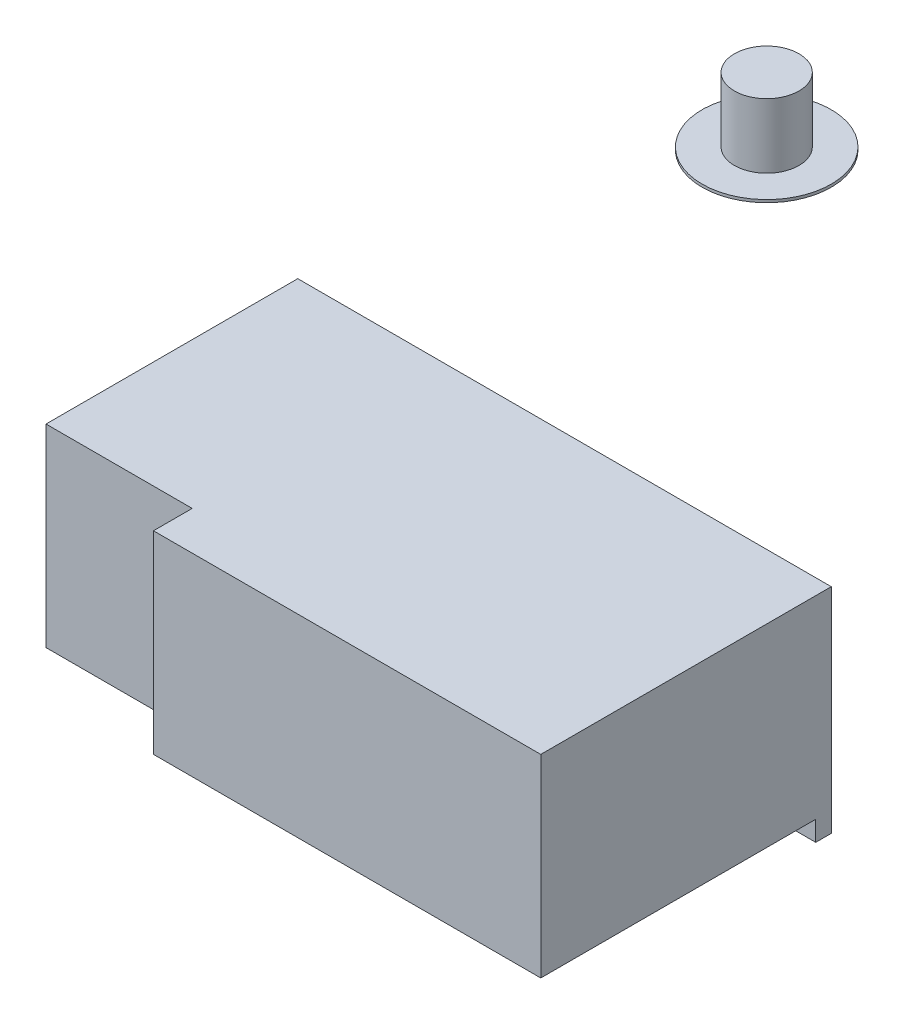
ISO-10303-21;
HEADER;
FILE_DESCRIPTION(('STEP AP214'),'2;1');
FILE_NAME('part.step','',(''),(''),'','','');
FILE_SCHEMA(('AUTOMOTIVE_DESIGN { 1 0 10303 214 1 1 1 1 }'));
ENDSEC;
DATA;
#1=APPLICATION_CONTEXT('core data for automotive mechanical design processes');
#2=APPLICATION_PROTOCOL_DEFINITION('international standard','automotive_design',2000,#1);
#3=PRODUCT_CONTEXT('',#1,'mechanical');
#4=PRODUCT('Part','Part','',(#3));
#5=PRODUCT_RELATED_PRODUCT_CATEGORY('part','',(#4));
#6=PRODUCT_DEFINITION_FORMATION('','',#4);
#7=PRODUCT_DEFINITION_CONTEXT('part definition',#1,'design');
#8=PRODUCT_DEFINITION('design','',#6,#7);
#9=PRODUCT_DEFINITION_SHAPE('','',#8);
#10=(LENGTH_UNIT() NAMED_UNIT(*) SI_UNIT(.MILLI.,.METRE.));
#11=(NAMED_UNIT(*) PLANE_ANGLE_UNIT() SI_UNIT($,.RADIAN.));
#12=(NAMED_UNIT(*) SI_UNIT($,.STERADIAN.) SOLID_ANGLE_UNIT());
#13=UNCERTAINTY_MEASURE_WITH_UNIT(LENGTH_MEASURE(1.E-05),#10,'distance_accuracy_value','');
#14=(GEOMETRIC_REPRESENTATION_CONTEXT(3) GLOBAL_UNCERTAINTY_ASSIGNED_CONTEXT((#13)) GLOBAL_UNIT_ASSIGNED_CONTEXT((#10,
#11,#12)) REPRESENTATION_CONTEXT('',''));
#15=CARTESIAN_POINT('',(0.,0.,0.));
#16=DIRECTION('',(0.,0.,1.));
#17=DIRECTION('',(1.,0.,0.));
#18=AXIS2_PLACEMENT_3D('',#15,#16,#17);
#19=CARTESIAN_POINT('',(0.,24.5,-10.));
#20=DIRECTION('',(0.,-1.,0.));
#21=DIRECTION('',(0.,0.,-1.));
#22=AXIS2_PLACEMENT_3D('',#19,#20,#21);
#23=CYLINDRICAL_SURFACE('',#22,5.);
#24=CARTESIAN_POINT('',(0.,24.2878637800781,-10.));
#25=DIRECTION('',(0.,1.,0.));
#26=DIRECTION('',(0.,0.,1.));
#27=AXIS2_PLACEMENT_3D('',#24,#25,#26);
#28=CIRCLE('',#27,5.);
#29=CARTESIAN_POINT('',(0.,24.2878637800781,-5.));
#30=VERTEX_POINT('',#29);
#31=EDGE_CURVE('E62',#30,#30,#28,.T.);
#32=ORIENTED_EDGE('',*,*,#31,.T.);
#33=EDGE_LOOP('',(#32));
#34=FACE_BOUND('',#33,.T.);
#35=CARTESIAN_POINT('',(0.,24.5,-10.));
#36=DIRECTION('',(0.,1.,0.));
#37=DIRECTION('',(0.,0.,1.));
#38=AXIS2_PLACEMENT_3D('',#35,#36,#37);
#39=CIRCLE('',#38,5.);
#40=CARTESIAN_POINT('',(0.,24.5,-5.));
#41=VERTEX_POINT('',#40);
#42=EDGE_CURVE('E58',#41,#41,#39,.T.);
#43=ORIENTED_EDGE('',*,*,#42,.F.);
#44=EDGE_LOOP('',(#43));
#45=FACE_BOUND('',#44,.T.);
#46=ADVANCED_FACE('F47',(#34,#45),#23,.T.);
#47=CARTESIAN_POINT('',(0.,24.5,-10.));
#48=DIRECTION('',(0.,1.,0.));
#49=DIRECTION('',(0.,0.,1.));
#50=AXIS2_PLACEMENT_3D('',#47,#48,#49);
#51=PLANE('',#50);
#52=CARTESIAN_POINT('',(0.,24.5,-10.));
#53=DIRECTION('',(0.,1.,0.));
#54=DIRECTION('',(0.,0.,1.));
#55=AXIS2_PLACEMENT_3D('',#52,#53,#54);
#56=CIRCLE('',#55,2.5);
#57=CARTESIAN_POINT('',(0.,24.5,-7.5));
#58=VERTEX_POINT('',#57);
#59=EDGE_CURVE('E54',#58,#58,#56,.T.);
#60=ORIENTED_EDGE('',*,*,#59,.F.);
#61=EDGE_LOOP('',(#60));
#62=FACE_BOUND('',#61,.T.);
#63=ORIENTED_EDGE('',*,*,#42,.T.);
#64=EDGE_LOOP('',(#63));
#65=FACE_BOUND('',#64,.T.);
#66=ADVANCED_FACE('F77',(#62,#65),#51,.T.);
#67=CARTESIAN_POINT('',(0.,29.5,-10.));
#68=DIRECTION('',(0.,-1.,0.));
#69=DIRECTION('',(0.,0.,-1.));
#70=AXIS2_PLACEMENT_3D('',#67,#68,#69);
#71=CYLINDRICAL_SURFACE('',#70,2.5);
#72=CARTESIAN_POINT('',(0.,29.5,-10.));
#73=DIRECTION('',(0.,1.,0.));
#74=DIRECTION('',(0.,0.,1.));
#75=AXIS2_PLACEMENT_3D('',#72,#73,#74);
#76=CIRCLE('',#75,2.5);
#77=CARTESIAN_POINT('',(0.,29.5,-7.5));
#78=VERTEX_POINT('',#77);
#79=EDGE_CURVE('E12',#78,#78,#76,.T.);
#80=ORIENTED_EDGE('',*,*,#79,.F.);
#81=EDGE_LOOP('',(#80));
#82=FACE_BOUND('',#81,.T.);
#83=ORIENTED_EDGE('',*,*,#59,.T.);
#84=EDGE_LOOP('',(#83));
#85=FACE_BOUND('',#84,.T.);
#86=ADVANCED_FACE('F75',(#82,#85),#71,.T.);
#87=CARTESIAN_POINT('',(0.,29.5,-10.));
#88=DIRECTION('',(0.,1.,0.));
#89=DIRECTION('',(0.,0.,1.));
#90=AXIS2_PLACEMENT_3D('',#87,#88,#89);
#91=PLANE('',#90);
#92=ORIENTED_EDGE('',*,*,#79,.T.);
#93=EDGE_LOOP('',(#92));
#94=FACE_BOUND('',#93,.T.);
#95=ADVANCED_FACE('F71',(#94),#91,.T.);
#96=CARTESIAN_POINT('',(26.55,24.2878637800781,0.));
#97=DIRECTION('',(0.,1.,0.));
#98=DIRECTION('',(0.,0.,1.));
#99=AXIS2_PLACEMENT_3D('',#96,#97,#98);
#100=PLANE('',#99);
#101=ORIENTED_EDGE('',*,*,#31,.F.);
#102=EDGE_LOOP('',(#101));
#103=FACE_BOUND('',#102,.T.);
#104=ADVANCED_FACE('F49',(#103),#100,.F.);
#105=CLOSED_SHELL('',(#46,#66,#86,#95,#104));
#106=MANIFOLD_SOLID_BREP('B2',#105);
#107=CARTESIAN_POINT('',(-15.,7.5,-22.5));
#108=DIRECTION('',(1.,0.,0.));
#109=DIRECTION('',(0.,0.,-1.));
#110=AXIS2_PLACEMENT_3D('',#107,#108,#109);
#111=PLANE('',#110);
#112=DIRECTION('',(0.,1.,0.));
#113=VECTOR('',#112,1.);
#114=CARTESIAN_POINT('',(-15.,7.5,19.5));
#115=LINE('',#114,#113);
#116=CARTESIAN_POINT('',(-15.,-7.5,19.5));
#117=VERTEX_POINT('',#116);
#118=CARTESIAN_POINT('',(-15.,7.5,19.5));
#119=VERTEX_POINT('',#118);
#120=EDGE_CURVE('E197',#117,#119,#115,.T.);
#121=ORIENTED_EDGE('',*,*,#120,.F.);
#122=DIRECTION('',(0.,0.,1.));
#123=VECTOR('',#122,1.);
#124=CARTESIAN_POINT('',(-15.,-7.5,-22.5));
#125=LINE('',#124,#123);
#126=CARTESIAN_POINT('',(-15.,-7.5,22.5));
#127=VERTEX_POINT('',#126);
#128=EDGE_CURVE('E214',#117,#127,#125,.T.);
#129=ORIENTED_EDGE('',*,*,#128,.T.);
#130=DIRECTION('',(0.,-1.,0.));
#131=VECTOR('',#130,1.);
#132=CARTESIAN_POINT('',(-15.,7.5,22.5));
#133=LINE('',#132,#131);
#134=CARTESIAN_POINT('',(-15.,7.5,22.5));
#135=VERTEX_POINT('',#134);
#136=EDGE_CURVE('E126',#135,#127,#133,.T.);
#137=ORIENTED_EDGE('',*,*,#136,.F.);
#138=DIRECTION('',(0.,0.,1.));
#139=VECTOR('',#138,1.);
#140=CARTESIAN_POINT('',(-15.,7.5,-22.5));
#141=LINE('',#140,#139);
#142=EDGE_CURVE('E206',#119,#135,#141,.T.);
#143=ORIENTED_EDGE('',*,*,#142,.F.);
#144=EDGE_LOOP('',(#121,#129,#137,#143));
#145=FACE_BOUND('',#144,.T.);
#146=ADVANCED_FACE('F118',(#145),#111,.F.);
#147=CARTESIAN_POINT('',(-31.,7.5,19.5));
#148=DIRECTION('',(0.,0.,-1.));
#149=DIRECTION('',(0.,1.,0.));
#150=AXIS2_PLACEMENT_3D('',#147,#148,#149);
#151=PLANE('',#150);
#152=DIRECTION('',(1.,0.,0.));
#153=VECTOR('',#152,1.);
#154=CARTESIAN_POINT('',(-31.,7.5,19.5));
#155=LINE('',#154,#153);
#156=CARTESIAN_POINT('',(-26.3220500008362,7.5,19.5));
#157=VERTEX_POINT('',#156);
#158=EDGE_CURVE('E191',#157,#119,#155,.T.);
#159=ORIENTED_EDGE('',*,*,#158,.F.);
#160=DIRECTION('',(0.,1.,0.));
#161=VECTOR('',#160,1.);
#162=CARTESIAN_POINT('',(-26.3220500008362,-12.5,19.5));
#163=LINE('',#162,#161);
#164=CARTESIAN_POINT('',(-26.3220500008362,-7.5,19.5));
#165=VERTEX_POINT('',#164);
#166=EDGE_CURVE('E181',#165,#157,#163,.T.);
#167=ORIENTED_EDGE('',*,*,#166,.F.);
#168=DIRECTION('',(1.,0.,0.));
#169=VECTOR('',#168,1.);
#170=CARTESIAN_POINT('',(-31.,-7.5,19.5));
#171=LINE('',#170,#169);
#172=EDGE_CURVE('E140',#165,#117,#171,.T.);
#173=ORIENTED_EDGE('',*,*,#172,.T.);
#174=ORIENTED_EDGE('',*,*,#120,.T.);
#175=EDGE_LOOP('',(#159,#167,#173,#174));
#176=FACE_BOUND('',#175,.T.);
#177=ADVANCED_FACE('F196',(#176),#151,.F.);
#178=CARTESIAN_POINT('',(-31.,-9.05,1.20322249247065));
#179=DIRECTION('',(0.,0.,-1.));
#180=DIRECTION('',(-1.,0.,0.));
#181=AXIS2_PLACEMENT_3D('',#178,#179,#180);
#182=PLANE('',#181);
#183=DIRECTION('',(-1.,0.,0.));
#184=VECTOR('',#183,1.);
#185=CARTESIAN_POINT('',(-31.,-7.5,1.20322249247065));
#186=LINE('',#185,#184);
#187=CARTESIAN_POINT('',(15.,-7.5,1.20322249247065));
#188=VERTEX_POINT('',#187);
#189=CARTESIAN_POINT('',(-26.3220500008362,-7.5,1.20322249247065));
#190=VERTEX_POINT('',#189);
#191=EDGE_CURVE('E232',#188,#190,#186,.T.);
#192=ORIENTED_EDGE('',*,*,#191,.T.);
#193=DIRECTION('',(0.,-1.,0.));
#194=VECTOR('',#193,1.);
#195=CARTESIAN_POINT('',(-26.3220500008362,-9.05,1.20322249247065));
#196=LINE('',#195,#194);
#197=CARTESIAN_POINT('',(-26.3220500008362,-9.05,1.20322249247065));
#198=VERTEX_POINT('',#197);
#199=EDGE_CURVE('E254',#190,#198,#196,.T.);
#200=ORIENTED_EDGE('',*,*,#199,.T.);
#201=DIRECTION('',(-1.,0.,0.));
#202=VECTOR('',#201,1.);
#203=CARTESIAN_POINT('',(-31.,-9.05,1.20322249247065));
#204=LINE('',#203,#202);
#205=CARTESIAN_POINT('',(15.,-9.05,1.20322249247065));
#206=VERTEX_POINT('',#205);
#207=EDGE_CURVE('E245',#206,#198,#204,.T.);
#208=ORIENTED_EDGE('',*,*,#207,.F.);
#209=DIRECTION('',(0.,1.,0.));
#210=VECTOR('',#209,1.);
#211=CARTESIAN_POINT('',(15.,-9.05,1.20322249247065));
#212=LINE('',#211,#210);
#213=EDGE_CURVE('E237',#206,#188,#212,.T.);
#214=ORIENTED_EDGE('',*,*,#213,.T.);
#215=EDGE_LOOP('',(#192,#200,#208,#214));
#216=FACE_BOUND('',#215,.T.);
#217=ADVANCED_FACE('F278',(#216),#182,.F.);
#218=CARTESIAN_POINT('',(0.,-7.5,0.));
#219=DIRECTION('',(0.,1.,0.));
#220=DIRECTION('',(0.,0.,1.));
#221=AXIS2_PLACEMENT_3D('',#218,#219,#220);
#222=PLANE('',#221);
#223=ORIENTED_EDGE('',*,*,#172,.F.);
#224=DIRECTION('',(0.,0.,-1.));
#225=VECTOR('',#224,1.);
#226=CARTESIAN_POINT('',(-26.3220500008362,-7.5,0.));
#227=LINE('',#226,#225);
#228=EDGE_CURVE('E184',#165,#190,#227,.T.);
#229=ORIENTED_EDGE('',*,*,#228,.T.);
#230=ORIENTED_EDGE('',*,*,#191,.F.);
#231=DIRECTION('',(0.,0.,-1.));
#232=VECTOR('',#231,1.);
#233=CARTESIAN_POINT('',(15.,-7.5,-22.5));
#234=LINE('',#233,#232);
#235=CARTESIAN_POINT('',(15.,-7.5,22.5));
#236=VERTEX_POINT('',#235);
#237=EDGE_CURVE('E199',#236,#188,#234,.T.);
#238=ORIENTED_EDGE('',*,*,#237,.F.);
#239=DIRECTION('',(1.,0.,0.));
#240=VECTOR('',#239,1.);
#241=CARTESIAN_POINT('',(-15.,-7.5,22.5));
#242=LINE('',#241,#240);
#243=EDGE_CURVE('E207',#127,#236,#242,.T.);
#244=ORIENTED_EDGE('',*,*,#243,.F.);
#245=ORIENTED_EDGE('',*,*,#128,.F.);
#246=EDGE_LOOP('',(#223,#229,#230,#238,#244,#245));
#247=FACE_BOUND('',#246,.T.);
#248=ADVANCED_FACE('F229',(#247),#222,.F.);
#249=CARTESIAN_POINT('',(-15.,7.5,22.5));
#250=DIRECTION('',(0.,0.,-1.));
#251=DIRECTION('',(-1.,0.,0.));
#252=AXIS2_PLACEMENT_3D('',#249,#250,#251);
#253=PLANE('',#252);
#254=ORIENTED_EDGE('',*,*,#243,.T.);
#255=DIRECTION('',(0.,-1.,0.));
#256=VECTOR('',#255,1.);
#257=CARTESIAN_POINT('',(15.,7.5,22.5));
#258=LINE('',#257,#256);
#259=CARTESIAN_POINT('',(15.,7.5,22.5));
#260=VERTEX_POINT('',#259);
#261=EDGE_CURVE('E211',#260,#236,#258,.T.);
#262=ORIENTED_EDGE('',*,*,#261,.F.);
#263=DIRECTION('',(1.,0.,0.));
#264=VECTOR('',#263,1.);
#265=CARTESIAN_POINT('',(-15.,7.5,22.5));
#266=LINE('',#265,#264);
#267=EDGE_CURVE('E209',#135,#260,#266,.T.);
#268=ORIENTED_EDGE('',*,*,#267,.F.);
#269=ORIENTED_EDGE('',*,*,#136,.T.);
#270=EDGE_LOOP('',(#254,#262,#268,#269));
#271=FACE_BOUND('',#270,.T.);
#272=ADVANCED_FACE('F223',(#271),#253,.F.);
#273=CARTESIAN_POINT('',(0.,-9.05,0.));
#274=DIRECTION('',(0.,1.,0.));
#275=DIRECTION('',(0.,0.,1.));
#276=AXIS2_PLACEMENT_3D('',#273,#274,#275);
#277=PLANE('',#276);
#278=ORIENTED_EDGE('',*,*,#207,.T.);
#279=DIRECTION('',(0.,0.,-1.));
#280=VECTOR('',#279,1.);
#281=CARTESIAN_POINT('',(-26.3220500008362,-9.05,0.));
#282=LINE('',#281,#280);
#283=CARTESIAN_POINT('',(-26.3220500008362,-9.05,0.));
#284=VERTEX_POINT('',#283);
#285=EDGE_CURVE('E186',#198,#284,#282,.T.);
#286=ORIENTED_EDGE('',*,*,#285,.T.);
#287=DIRECTION('',(1.,0.,0.));
#288=VECTOR('',#287,1.);
#289=CARTESIAN_POINT('',(-31.,-9.05,0.));
#290=LINE('',#289,#288);
#291=CARTESIAN_POINT('',(15.,-9.05,0.));
#292=VERTEX_POINT('',#291);
#293=EDGE_CURVE('E247',#284,#292,#290,.T.);
#294=ORIENTED_EDGE('',*,*,#293,.T.);
#295=DIRECTION('',(0.,0.,1.));
#296=VECTOR('',#295,1.);
#297=CARTESIAN_POINT('',(15.,-9.05,0.));
#298=LINE('',#297,#296);
#299=EDGE_CURVE('E250',#292,#206,#298,.T.);
#300=ORIENTED_EDGE('',*,*,#299,.T.);
#301=EDGE_LOOP('',(#278,#286,#294,#300));
#302=FACE_BOUND('',#301,.T.);
#303=ADVANCED_FACE('F260',(#302),#277,.F.);
#304=CARTESIAN_POINT('',(15.,7.5,-22.5));
#305=DIRECTION('',(-1.,0.,0.));
#306=DIRECTION('',(0.,0.,1.));
#307=AXIS2_PLACEMENT_3D('',#304,#305,#306);
#308=PLANE('',#307);
#309=DIRECTION('',(0.,1.,0.));
#310=VECTOR('',#309,1.);
#311=CARTESIAN_POINT('',(15.,-9.05,0.));
#312=LINE('',#311,#310);
#313=CARTESIAN_POINT('',(15.,7.5,0.));
#314=VERTEX_POINT('',#313);
#315=EDGE_CURVE('E241',#292,#314,#312,.T.);
#316=ORIENTED_EDGE('',*,*,#315,.T.);
#317=DIRECTION('',(0.,0.,-1.));
#318=VECTOR('',#317,1.);
#319=CARTESIAN_POINT('',(15.,7.5,-22.5));
#320=LINE('',#319,#318);
#321=EDGE_CURVE('E204',#260,#314,#320,.T.);
#322=ORIENTED_EDGE('',*,*,#321,.F.);
#323=ORIENTED_EDGE('',*,*,#261,.T.);
#324=ORIENTED_EDGE('',*,*,#237,.T.);
#325=ORIENTED_EDGE('',*,*,#213,.F.);
#326=ORIENTED_EDGE('',*,*,#299,.F.);
#327=EDGE_LOOP('',(#316,#322,#323,#324,#325,#326));
#328=FACE_BOUND('',#327,.T.);
#329=ADVANCED_FACE('F120',(#328),#308,.F.);
#330=CARTESIAN_POINT('',(0.,7.5,0.));
#331=DIRECTION('',(0.,1.,0.));
#332=DIRECTION('',(0.,0.,1.));
#333=AXIS2_PLACEMENT_3D('',#330,#331,#332);
#334=PLANE('',#333);
#335=DIRECTION('',(0.,0.,-1.));
#336=VECTOR('',#335,1.);
#337=CARTESIAN_POINT('',(-26.3220500008362,7.5,19.5));
#338=LINE('',#337,#336);
#339=CARTESIAN_POINT('',(-26.3220500008362,7.5,0.));
#340=VERTEX_POINT('',#339);
#341=EDGE_CURVE('E133',#157,#340,#338,.T.);
#342=ORIENTED_EDGE('',*,*,#341,.F.);
#343=ORIENTED_EDGE('',*,*,#158,.T.);
#344=ORIENTED_EDGE('',*,*,#142,.T.);
#345=ORIENTED_EDGE('',*,*,#267,.T.);
#346=ORIENTED_EDGE('',*,*,#321,.T.);
#347=DIRECTION('',(1.,0.,0.));
#348=VECTOR('',#347,1.);
#349=CARTESIAN_POINT('',(-31.,7.5,0.));
#350=LINE('',#349,#348);
#351=EDGE_CURVE('E194',#340,#314,#350,.T.);
#352=ORIENTED_EDGE('',*,*,#351,.F.);
#353=EDGE_LOOP('',(#342,#343,#344,#345,#346,#352));
#354=FACE_BOUND('',#353,.T.);
#355=ADVANCED_FACE('F190',(#354),#334,.T.);
#356=CARTESIAN_POINT('',(-31.,7.5,0.));
#357=DIRECTION('',(0.,0.,1.));
#358=DIRECTION('',(1.,0.,0.));
#359=AXIS2_PLACEMENT_3D('',#356,#357,#358);
#360=PLANE('',#359);
#361=ORIENTED_EDGE('',*,*,#293,.F.);
#362=DIRECTION('',(0.,1.,0.));
#363=VECTOR('',#362,1.);
#364=CARTESIAN_POINT('',(-26.3220500008362,7.5,0.));
#365=LINE('',#364,#363);
#366=EDGE_CURVE('E45',#284,#340,#365,.T.);
#367=ORIENTED_EDGE('',*,*,#366,.T.);
#368=ORIENTED_EDGE('',*,*,#351,.T.);
#369=ORIENTED_EDGE('',*,*,#315,.F.);
#370=EDGE_LOOP('',(#361,#367,#368,#369));
#371=FACE_BOUND('',#370,.T.);
#372=ADVANCED_FACE('F262',(#371),#360,.F.);
#373=CARTESIAN_POINT('',(-26.3220500008362,-12.5,19.5));
#374=DIRECTION('',(1.,0.,0.));
#375=DIRECTION('',(0.,0.,-1.));
#376=AXIS2_PLACEMENT_3D('',#373,#374,#375);
#377=PLANE('',#376);
#378=ORIENTED_EDGE('',*,*,#166,.T.);
#379=ORIENTED_EDGE('',*,*,#341,.T.);
#380=ORIENTED_EDGE('',*,*,#366,.F.);
#381=ORIENTED_EDGE('',*,*,#285,.F.);
#382=ORIENTED_EDGE('',*,*,#199,.F.);
#383=ORIENTED_EDGE('',*,*,#228,.F.);
#384=EDGE_LOOP('',(#378,#379,#380,#381,#382,#383));
#385=FACE_BOUND('',#384,.T.);
#386=ADVANCED_FACE('F182',(#385),#377,.F.);
#387=CLOSED_SHELL('',(#146,#177,#217,#248,#272,#303,#329,#355,#372,#386));
#388=MANIFOLD_SOLID_BREP('B7',#387);
#389=ADVANCED_BREP_SHAPE_REPRESENTATION('',(#18,#106,#388),#14);
#390=SHAPE_DEFINITION_REPRESENTATION(#9,#389);
ENDSEC;
END-ISO-10303-21;
